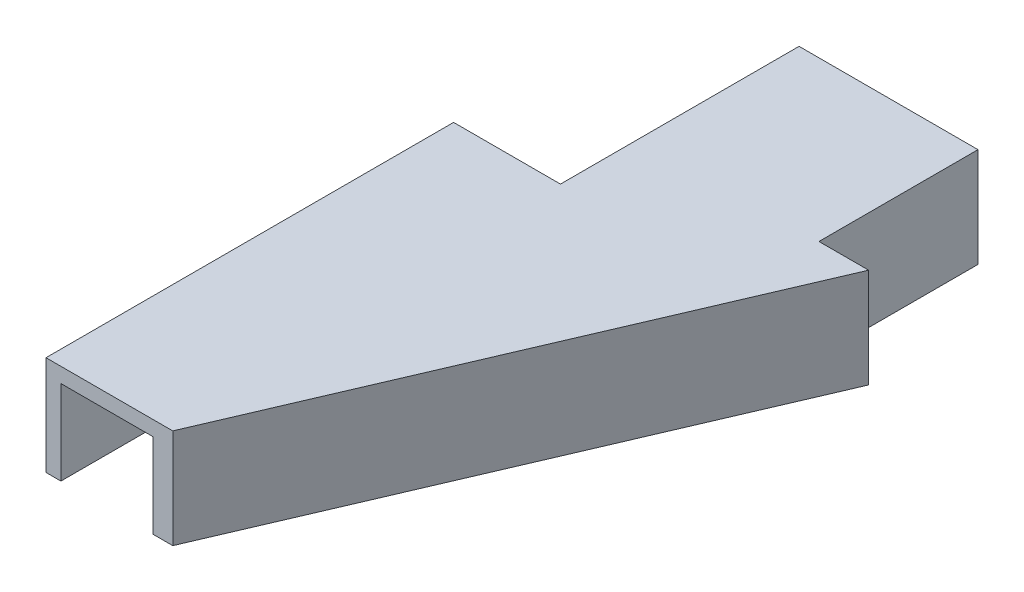
ISO-10303-21;
HEADER;
FILE_DESCRIPTION(('STEP AP214'),'2;1');
FILE_NAME('part.step','',(''),(''),'','','');
FILE_SCHEMA(('AUTOMOTIVE_DESIGN { 1 0 10303 214 1 1 1 1 }'));
ENDSEC;
DATA;
#1=APPLICATION_CONTEXT('core data for automotive mechanical design processes');
#2=APPLICATION_PROTOCOL_DEFINITION('international standard','automotive_design',2000,#1);
#3=PRODUCT_CONTEXT('',#1,'mechanical');
#4=PRODUCT('Part','Part','',(#3));
#5=PRODUCT_RELATED_PRODUCT_CATEGORY('part','',(#4));
#6=PRODUCT_DEFINITION_FORMATION('','',#4);
#7=PRODUCT_DEFINITION_CONTEXT('part definition',#1,'design');
#8=PRODUCT_DEFINITION('design','',#6,#7);
#9=PRODUCT_DEFINITION_SHAPE('','',#8);
#10=(LENGTH_UNIT() NAMED_UNIT(*) SI_UNIT(.MILLI.,.METRE.));
#11=(NAMED_UNIT(*) PLANE_ANGLE_UNIT() SI_UNIT($,.RADIAN.));
#12=(NAMED_UNIT(*) SI_UNIT($,.STERADIAN.) SOLID_ANGLE_UNIT());
#13=UNCERTAINTY_MEASURE_WITH_UNIT(LENGTH_MEASURE(1.E-05),#10,'distance_accuracy_value','');
#14=(GEOMETRIC_REPRESENTATION_CONTEXT(3) GLOBAL_UNCERTAINTY_ASSIGNED_CONTEXT((#13)) GLOBAL_UNIT_ASSIGNED_CONTEXT((#10,
#11,#12)) REPRESENTATION_CONTEXT('',''));
#15=CARTESIAN_POINT('',(0.,0.,0.));
#16=DIRECTION('',(0.,0.,1.));
#17=DIRECTION('',(1.,0.,0.));
#18=AXIS2_PLACEMENT_3D('',#15,#16,#17);
#19=CARTESIAN_POINT('',(0.,20.,0.));
#20=DIRECTION('',(1.,0.,0.));
#21=DIRECTION('',(0.,0.,-1.));
#22=AXIS2_PLACEMENT_3D('',#19,#20,#21);
#23=PLANE('',#22);
#24=DIRECTION('',(0.,-1.,0.));
#25=VECTOR('',#24,1.);
#26=CARTESIAN_POINT('',(0.,0.,-80.));
#27=LINE('',#26,#25);
#28=CARTESIAN_POINT('',(0.,17.,-80.));
#29=VERTEX_POINT('',#28);
#30=CARTESIAN_POINT('',(0.,0.,-80.));
#31=VERTEX_POINT('',#30);
#32=EDGE_CURVE('E243',#29,#31,#27,.T.);
#33=ORIENTED_EDGE('',*,*,#32,.T.);
#34=DIRECTION('',(0.,0.,1.));
#35=VECTOR('',#34,1.);
#36=CARTESIAN_POINT('',(0.,0.,0.));
#37=LINE('',#36,#35);
#38=CARTESIAN_POINT('',(0.,0.,0.));
#39=VERTEX_POINT('',#38);
#40=EDGE_CURVE('E85',#31,#39,#37,.T.);
#41=ORIENTED_EDGE('',*,*,#40,.T.);
#42=DIRECTION('',(0.,-1.,0.));
#43=VECTOR('',#42,1.);
#44=CARTESIAN_POINT('',(0.,20.,0.));
#45=LINE('',#44,#43);
#46=CARTESIAN_POINT('',(0.,17.,0.));
#47=VERTEX_POINT('',#46);
#48=EDGE_CURVE('E126',#47,#39,#45,.T.);
#49=ORIENTED_EDGE('',*,*,#48,.F.);
#50=DIRECTION('',(0.,0.,1.));
#51=VECTOR('',#50,1.);
#52=CARTESIAN_POINT('',(0.,17.,-85.));
#53=LINE('',#52,#51);
#54=EDGE_CURVE('E131',#29,#47,#53,.T.);
#55=ORIENTED_EDGE('',*,*,#54,.F.);
#56=EDGE_LOOP('',(#33,#41,#49,#55));
#57=FACE_BOUND('',#56,.T.);
#58=ADVANCED_FACE('F33',(#57),#23,.F.);
#59=CARTESIAN_POINT('',(0.,20.,0.));
#60=DIRECTION('',(0.,-1.,0.));
#61=DIRECTION('',(0.,0.,-1.));
#62=AXIS2_PLACEMENT_3D('',#59,#60,#61);
#63=PLANE('',#62);
#64=DIRECTION('',(0.,0.,1.));
#65=VECTOR('',#64,1.);
#66=CARTESIAN_POINT('',(0.,20.,0.));
#67=LINE('',#66,#65);
#68=CARTESIAN_POINT('',(0.,20.,-130.));
#69=VERTEX_POINT('',#68);
#70=CARTESIAN_POINT('',(0.,20.,-82.));
#71=VERTEX_POINT('',#70);
#72=EDGE_CURVE('E121',#69,#71,#67,.T.);
#73=ORIENTED_EDGE('',*,*,#72,.T.);
#74=DIRECTION('',(1.,0.,0.));
#75=VECTOR('',#74,1.);
#76=CARTESIAN_POINT('',(-21.5,20.,-82.));
#77=LINE('',#76,#75);
#78=CARTESIAN_POINT('',(-21.5,20.,-82.));
#79=VERTEX_POINT('',#78);
#80=EDGE_CURVE('E164',#79,#71,#77,.T.);
#81=ORIENTED_EDGE('',*,*,#80,.F.);
#82=DIRECTION('',(0.,0.,1.));
#83=VECTOR('',#82,1.);
#84=CARTESIAN_POINT('',(-21.5,20.,-85.));
#85=LINE('',#84,#83);
#86=CARTESIAN_POINT('',(-21.5,20.,0.));
#87=VERTEX_POINT('',#86);
#88=EDGE_CURVE('E241',#79,#87,#85,.T.);
#89=ORIENTED_EDGE('',*,*,#88,.T.);
#90=DIRECTION('',(1.,0.,0.));
#91=VECTOR('',#90,1.);
#92=CARTESIAN_POINT('',(0.,20.,0.));
#93=LINE('',#92,#91);
#94=CARTESIAN_POINT('',(4.,20.,0.));
#95=VERTEX_POINT('',#94);
#96=EDGE_CURVE('E141',#87,#95,#93,.T.);
#97=ORIENTED_EDGE('',*,*,#96,.T.);
#98=DIRECTION('',(0.393919298579168,0.,-0.919145030018058));
#99=VECTOR('',#98,1.);
#100=CARTESIAN_POINT('',(4.,20.,0.));
#101=LINE('',#100,#99);
#102=CARTESIAN_POINT('',(46.,20.,-98.));
#103=VERTEX_POINT('',#102);
#104=EDGE_CURVE('E93',#95,#103,#101,.T.);
#105=ORIENTED_EDGE('',*,*,#104,.T.);
#106=DIRECTION('',(-1.,0.,0.));
#107=VECTOR('',#106,1.);
#108=CARTESIAN_POINT('',(36.,20.,-98.));
#109=LINE('',#108,#107);
#110=CARTESIAN_POINT('',(36.,20.,-98.));
#111=VERTEX_POINT('',#110);
#112=EDGE_CURVE('E100',#103,#111,#109,.T.);
#113=ORIENTED_EDGE('',*,*,#112,.T.);
#114=DIRECTION('',(0.,0.,-1.));
#115=VECTOR('',#114,1.);
#116=CARTESIAN_POINT('',(36.,20.,-130.));
#117=LINE('',#116,#115);
#118=CARTESIAN_POINT('',(36.,20.,-130.));
#119=VERTEX_POINT('',#118);
#120=EDGE_CURVE('E104',#111,#119,#117,.T.);
#121=ORIENTED_EDGE('',*,*,#120,.T.);
#122=DIRECTION('',(-1.,0.,0.));
#123=VECTOR('',#122,1.);
#124=CARTESIAN_POINT('',(0.,20.,-130.));
#125=LINE('',#124,#123);
#126=EDGE_CURVE('E57',#119,#69,#125,.T.);
#127=ORIENTED_EDGE('',*,*,#126,.T.);
#128=EDGE_LOOP('',(#73,#81,#89,#97,#105,#113,#121,#127));
#129=FACE_BOUND('',#128,.T.);
#130=ADVANCED_FACE('F102',(#129),#63,.F.);
#131=CARTESIAN_POINT('',(-18.5,17.,-85.));
#132=DIRECTION('',(0.,-1.,0.));
#133=DIRECTION('',(0.,0.,-1.));
#134=AXIS2_PLACEMENT_3D('',#131,#132,#133);
#135=PLANE('',#134);
#136=DIRECTION('',(0.,0.,1.));
#137=VECTOR('',#136,1.);
#138=CARTESIAN_POINT('',(-18.5,17.,-85.));
#139=LINE('',#138,#137);
#140=CARTESIAN_POINT('',(-18.5,17.,-80.));
#141=VERTEX_POINT('',#140);
#142=CARTESIAN_POINT('',(-18.5,17.,0.));
#143=VERTEX_POINT('',#142);
#144=EDGE_CURVE('E226',#141,#143,#139,.T.);
#145=ORIENTED_EDGE('',*,*,#144,.F.);
#146=DIRECTION('',(1.,0.,0.));
#147=VECTOR('',#146,1.);
#148=CARTESIAN_POINT('',(-18.5,17.,-80.));
#149=LINE('',#148,#147);
#150=EDGE_CURVE('E236',#141,#29,#149,.T.);
#151=ORIENTED_EDGE('',*,*,#150,.T.);
#152=ORIENTED_EDGE('',*,*,#54,.T.);
#153=DIRECTION('',(1.,0.,0.));
#154=VECTOR('',#153,1.);
#155=CARTESIAN_POINT('',(-18.5,17.,0.));
#156=LINE('',#155,#154);
#157=EDGE_CURVE('E235',#143,#47,#156,.T.);
#158=ORIENTED_EDGE('',*,*,#157,.F.);
#159=EDGE_LOOP('',(#145,#151,#152,#158));
#160=FACE_BOUND('',#159,.T.);
#161=ADVANCED_FACE('F234',(#160),#135,.T.);
#162=CARTESIAN_POINT('',(-18.5,0.,-85.));
#163=DIRECTION('',(1.,0.,0.));
#164=DIRECTION('',(0.,0.,-1.));
#165=AXIS2_PLACEMENT_3D('',#162,#163,#164);
#166=PLANE('',#165);
#167=DIRECTION('',(0.,0.,1.));
#168=VECTOR('',#167,1.);
#169=CARTESIAN_POINT('',(-18.5,0.,-85.));
#170=LINE('',#169,#168);
#171=CARTESIAN_POINT('',(-18.5,0.,-80.));
#172=VERTEX_POINT('',#171);
#173=CARTESIAN_POINT('',(-18.5,0.,0.));
#174=VERTEX_POINT('',#173);
#175=EDGE_CURVE('E321',#172,#174,#170,.T.);
#176=ORIENTED_EDGE('',*,*,#175,.F.);
#177=DIRECTION('',(0.,1.,0.));
#178=VECTOR('',#177,1.);
#179=CARTESIAN_POINT('',(-18.5,0.,-80.));
#180=LINE('',#179,#178);
#181=EDGE_CURVE('E303',#172,#141,#180,.T.);
#182=ORIENTED_EDGE('',*,*,#181,.T.);
#183=ORIENTED_EDGE('',*,*,#144,.T.);
#184=DIRECTION('',(0.,1.,0.));
#185=VECTOR('',#184,1.);
#186=CARTESIAN_POINT('',(-18.5,0.,0.));
#187=LINE('',#186,#185);
#188=EDGE_CURVE('E240',#174,#143,#187,.T.);
#189=ORIENTED_EDGE('',*,*,#188,.F.);
#190=EDGE_LOOP('',(#176,#182,#183,#189));
#191=FACE_BOUND('',#190,.T.);
#192=ADVANCED_FACE('F259',(#191),#166,.T.);
#193=CARTESIAN_POINT('',(-21.5,20.,-85.));
#194=DIRECTION('',(-1.,0.,0.));
#195=DIRECTION('',(0.,-1.,0.));
#196=AXIS2_PLACEMENT_3D('',#193,#194,#195);
#197=PLANE('',#196);
#198=ORIENTED_EDGE('',*,*,#88,.F.);
#199=DIRECTION('',(0.,1.,0.));
#200=VECTOR('',#199,1.);
#201=CARTESIAN_POINT('',(-21.5,0.,-82.));
#202=LINE('',#201,#200);
#203=CARTESIAN_POINT('',(-21.5,0.,-82.));
#204=VERTEX_POINT('',#203);
#205=EDGE_CURVE('E475',#204,#79,#202,.T.);
#206=ORIENTED_EDGE('',*,*,#205,.F.);
#207=DIRECTION('',(0.,0.,1.));
#208=VECTOR('',#207,1.);
#209=CARTESIAN_POINT('',(-21.5,0.,-85.));
#210=LINE('',#209,#208);
#211=CARTESIAN_POINT('',(-21.5,0.,0.));
#212=VERTEX_POINT('',#211);
#213=EDGE_CURVE('E323',#204,#212,#210,.T.);
#214=ORIENTED_EDGE('',*,*,#213,.T.);
#215=DIRECTION('',(0.,-1.,0.));
#216=VECTOR('',#215,1.);
#217=CARTESIAN_POINT('',(-21.5,20.,0.));
#218=LINE('',#217,#216);
#219=EDGE_CURVE('E314',#87,#212,#218,.T.);
#220=ORIENTED_EDGE('',*,*,#219,.F.);
#221=EDGE_LOOP('',(#198,#206,#214,#220));
#222=FACE_BOUND('',#221,.T.);
#223=ADVANCED_FACE('F253',(#222),#197,.T.);
#224=CARTESIAN_POINT('',(0.,0.,-130.));
#225=VERTEX_POINT('',#224);
#226=CARTESIAN_POINT('',(0.,0.,-82.));
#227=VERTEX_POINT('',#226);
#228=EDGE_CURVE('E138',#225,#227,#37,.T.);
#229=ORIENTED_EDGE('',*,*,#228,.T.);
#230=DIRECTION('',(0.,-1.,0.));
#231=VECTOR('',#230,1.);
#232=CARTESIAN_POINT('',(0.,0.,-82.));
#233=LINE('',#232,#231);
#234=EDGE_CURVE('E159',#71,#227,#233,.T.);
#235=ORIENTED_EDGE('',*,*,#234,.F.);
#236=ORIENTED_EDGE('',*,*,#72,.F.);
#237=DIRECTION('',(0.,-1.,0.));
#238=VECTOR('',#237,1.);
#239=CARTESIAN_POINT('',(0.,20.,-130.));
#240=LINE('',#239,#238);
#241=EDGE_CURVE('E143',#69,#225,#240,.T.);
#242=ORIENTED_EDGE('',*,*,#241,.T.);
#243=EDGE_LOOP('',(#229,#235,#236,#242));
#244=FACE_BOUND('',#243,.T.);
#245=ADVANCED_FACE('F156',(#244),#23,.F.);
#246=CARTESIAN_POINT('',(0.,20.,0.));
#247=DIRECTION('',(0.,0.,-1.));
#248=DIRECTION('',(-1.,0.,0.));
#249=AXIS2_PLACEMENT_3D('',#246,#247,#248);
#250=PLANE('',#249);
#251=DIRECTION('',(1.,0.,0.));
#252=VECTOR('',#251,1.);
#253=CARTESIAN_POINT('',(0.,0.,0.));
#254=LINE('',#253,#252);
#255=CARTESIAN_POINT('',(4.,0.,0.));
#256=VERTEX_POINT('',#255);
#257=EDGE_CURVE('E127',#39,#256,#254,.T.);
#258=ORIENTED_EDGE('',*,*,#257,.T.);
#259=DIRECTION('',(0.,-1.,0.));
#260=VECTOR('',#259,1.);
#261=CARTESIAN_POINT('',(4.,20.,0.));
#262=LINE('',#261,#260);
#263=EDGE_CURVE('E11',#95,#256,#262,.T.);
#264=ORIENTED_EDGE('',*,*,#263,.F.);
#265=ORIENTED_EDGE('',*,*,#96,.F.);
#266=ORIENTED_EDGE('',*,*,#219,.T.);
#267=DIRECTION('',(1.,0.,0.));
#268=VECTOR('',#267,1.);
#269=CARTESIAN_POINT('',(-21.5,0.,0.));
#270=LINE('',#269,#268);
#271=EDGE_CURVE('E317',#212,#174,#270,.T.);
#272=ORIENTED_EDGE('',*,*,#271,.T.);
#273=ORIENTED_EDGE('',*,*,#188,.T.);
#274=ORIENTED_EDGE('',*,*,#157,.T.);
#275=ORIENTED_EDGE('',*,*,#48,.T.);
#276=EDGE_LOOP('',(#258,#264,#265,#266,#272,#273,#274,#275));
#277=FACE_BOUND('',#276,.T.);
#278=ADVANCED_FACE('F35',(#277),#250,.F.);
#279=CARTESIAN_POINT('',(4.,20.,0.));
#280=DIRECTION('',(-0.919145030018058,0.,-0.393919298579168));
#281=DIRECTION('',(-0.393919298579168,0.,0.919145030018058));
#282=AXIS2_PLACEMENT_3D('',#279,#280,#281);
#283=PLANE('',#282);
#284=DIRECTION('',(0.393919298579168,0.,-0.919145030018058));
#285=VECTOR('',#284,1.);
#286=CARTESIAN_POINT('',(4.,0.,0.));
#287=LINE('',#286,#285);
#288=CARTESIAN_POINT('',(46.,0.,-98.));
#289=VERTEX_POINT('',#288);
#290=EDGE_CURVE('E130',#256,#289,#287,.T.);
#291=ORIENTED_EDGE('',*,*,#290,.T.);
#292=DIRECTION('',(0.,-1.,0.));
#293=VECTOR('',#292,1.);
#294=CARTESIAN_POINT('',(46.,20.,-98.));
#295=LINE('',#294,#293);
#296=EDGE_CURVE('E41',#103,#289,#295,.T.);
#297=ORIENTED_EDGE('',*,*,#296,.F.);
#298=ORIENTED_EDGE('',*,*,#104,.F.);
#299=ORIENTED_EDGE('',*,*,#263,.T.);
#300=EDGE_LOOP('',(#291,#297,#298,#299));
#301=FACE_BOUND('',#300,.T.);
#302=ADVANCED_FACE('F258',(#301),#283,.F.);
#303=CARTESIAN_POINT('',(36.,20.,-98.));
#304=DIRECTION('',(0.,0.,1.));
#305=DIRECTION('',(1.,0.,0.));
#306=AXIS2_PLACEMENT_3D('',#303,#304,#305);
#307=PLANE('',#306);
#308=DIRECTION('',(-1.,0.,0.));
#309=VECTOR('',#308,1.);
#310=CARTESIAN_POINT('',(36.,0.,-98.));
#311=LINE('',#310,#309);
#312=CARTESIAN_POINT('',(36.,0.,-98.));
#313=VERTEX_POINT('',#312);
#314=EDGE_CURVE('E113',#289,#313,#311,.T.);
#315=ORIENTED_EDGE('',*,*,#314,.T.);
#316=DIRECTION('',(0.,-1.,0.));
#317=VECTOR('',#316,1.);
#318=CARTESIAN_POINT('',(36.,20.,-98.));
#319=LINE('',#318,#317);
#320=EDGE_CURVE('E110',#111,#313,#319,.T.);
#321=ORIENTED_EDGE('',*,*,#320,.F.);
#322=ORIENTED_EDGE('',*,*,#112,.F.);
#323=ORIENTED_EDGE('',*,*,#296,.T.);
#324=EDGE_LOOP('',(#315,#321,#322,#323));
#325=FACE_BOUND('',#324,.T.);
#326=ADVANCED_FACE('F111',(#325),#307,.F.);
#327=CARTESIAN_POINT('',(36.,20.,-130.));
#328=DIRECTION('',(-1.,0.,0.));
#329=DIRECTION('',(0.,0.,1.));
#330=AXIS2_PLACEMENT_3D('',#327,#328,#329);
#331=PLANE('',#330);
#332=DIRECTION('',(0.,0.,-1.));
#333=VECTOR('',#332,1.);
#334=CARTESIAN_POINT('',(36.,0.,-130.));
#335=LINE('',#334,#333);
#336=CARTESIAN_POINT('',(36.,0.,-130.));
#337=VERTEX_POINT('',#336);
#338=EDGE_CURVE('E134',#313,#337,#335,.T.);
#339=ORIENTED_EDGE('',*,*,#338,.T.);
#340=DIRECTION('',(0.,-1.,0.));
#341=VECTOR('',#340,1.);
#342=CARTESIAN_POINT('',(36.,20.,-130.));
#343=LINE('',#342,#341);
#344=EDGE_CURVE('E116',#119,#337,#343,.T.);
#345=ORIENTED_EDGE('',*,*,#344,.F.);
#346=ORIENTED_EDGE('',*,*,#120,.F.);
#347=ORIENTED_EDGE('',*,*,#320,.T.);
#348=EDGE_LOOP('',(#339,#345,#346,#347));
#349=FACE_BOUND('',#348,.T.);
#350=ADVANCED_FACE('F118',(#349),#331,.F.);
#351=CARTESIAN_POINT('',(0.,20.,-130.));
#352=DIRECTION('',(0.,0.,1.));
#353=DIRECTION('',(1.,0.,0.));
#354=AXIS2_PLACEMENT_3D('',#351,#352,#353);
#355=PLANE('',#354);
#356=DIRECTION('',(-1.,0.,0.));
#357=VECTOR('',#356,1.);
#358=CARTESIAN_POINT('',(0.,0.,-130.));
#359=LINE('',#358,#357);
#360=EDGE_CURVE('E136',#337,#225,#359,.T.);
#361=ORIENTED_EDGE('',*,*,#360,.T.);
#362=ORIENTED_EDGE('',*,*,#241,.F.);
#363=ORIENTED_EDGE('',*,*,#126,.F.);
#364=ORIENTED_EDGE('',*,*,#344,.T.);
#365=EDGE_LOOP('',(#361,#362,#363,#364));
#366=FACE_BOUND('',#365,.T.);
#367=ADVANCED_FACE('F152',(#366),#355,.F.);
#368=CARTESIAN_POINT('',(0.,0.,0.));
#369=DIRECTION('',(0.,-1.,0.));
#370=DIRECTION('',(0.,0.,-1.));
#371=AXIS2_PLACEMENT_3D('',#368,#369,#370);
#372=PLANE('',#371);
#373=DIRECTION('',(-0.393919298579167,0.,0.919145030018058));
#374=VECTOR('',#373,1.);
#375=CARTESIAN_POINT('',(38.4173049243829,0.,-93.));
#376=LINE('',#375,#374);
#377=CARTESIAN_POINT('',(38.4173049243829,0.,-93.));
#378=VERTEX_POINT('',#377);
#379=CARTESIAN_POINT('',(5.,0.,-15.0262885097732));
#380=VERTEX_POINT('',#379);
#381=EDGE_CURVE('E48',#378,#380,#376,.T.);
#382=ORIENTED_EDGE('',*,*,#381,.F.);
#383=DIRECTION('',(1.,0.,0.));
#384=VECTOR('',#383,1.);
#385=CARTESIAN_POINT('',(31.,0.,-93.));
#386=LINE('',#385,#384);
#387=CARTESIAN_POINT('',(31.,0.,-93.));
#388=VERTEX_POINT('',#387);
#389=EDGE_CURVE('E280',#388,#378,#386,.T.);
#390=ORIENTED_EDGE('',*,*,#389,.F.);
#391=DIRECTION('',(0.,0.,1.));
#392=VECTOR('',#391,1.);
#393=CARTESIAN_POINT('',(31.,0.,-125.));
#394=LINE('',#393,#392);
#395=CARTESIAN_POINT('',(31.,0.,-125.));
#396=VERTEX_POINT('',#395);
#397=EDGE_CURVE('E296',#396,#388,#394,.T.);
#398=ORIENTED_EDGE('',*,*,#397,.F.);
#399=DIRECTION('',(1.,0.,0.));
#400=VECTOR('',#399,1.);
#401=CARTESIAN_POINT('',(5.,0.,-125.));
#402=LINE('',#401,#400);
#403=CARTESIAN_POINT('',(5.,0.,-125.));
#404=VERTEX_POINT('',#403);
#405=EDGE_CURVE('E286',#404,#396,#402,.T.);
#406=ORIENTED_EDGE('',*,*,#405,.F.);
#407=DIRECTION('',(0.,0.,-1.));
#408=VECTOR('',#407,1.);
#409=CARTESIAN_POINT('',(5.,0.,-15.0262885097732));
#410=LINE('',#409,#408);
#411=EDGE_CURVE('E283',#380,#404,#410,.T.);
#412=ORIENTED_EDGE('',*,*,#411,.F.);
#413=EDGE_LOOP('',(#382,#390,#398,#406,#412));
#414=FACE_BOUND('',#413,.T.);
#415=ORIENTED_EDGE('',*,*,#257,.F.);
#416=ORIENTED_EDGE('',*,*,#40,.F.);
#417=DIRECTION('',(-1.,0.,0.));
#418=VECTOR('',#417,1.);
#419=CARTESIAN_POINT('',(-21.5,0.,-80.));
#420=LINE('',#419,#418);
#421=EDGE_CURVE('E474',#31,#172,#420,.T.);
#422=ORIENTED_EDGE('',*,*,#421,.T.);
#423=ORIENTED_EDGE('',*,*,#175,.T.);
#424=ORIENTED_EDGE('',*,*,#271,.F.);
#425=ORIENTED_EDGE('',*,*,#213,.F.);
#426=DIRECTION('',(-1.,0.,0.));
#427=VECTOR('',#426,1.);
#428=CARTESIAN_POINT('',(-21.5,0.,-82.));
#429=LINE('',#428,#427);
#430=EDGE_CURVE('E284',#227,#204,#429,.T.);
#431=ORIENTED_EDGE('',*,*,#430,.F.);
#432=ORIENTED_EDGE('',*,*,#228,.F.);
#433=ORIENTED_EDGE('',*,*,#360,.F.);
#434=ORIENTED_EDGE('',*,*,#338,.F.);
#435=ORIENTED_EDGE('',*,*,#314,.F.);
#436=ORIENTED_EDGE('',*,*,#290,.F.);
#437=EDGE_LOOP('',(#415,#416,#422,#423,#424,#425,#431,#432,#433,#434,#435,#436));
#438=FACE_BOUND('',#437,.T.);
#439=ADVANCED_FACE('F148',(#414,#438),#372,.T.);
#440=CARTESIAN_POINT('',(38.4173049243829,17.,-93.));
#441=DIRECTION('',(0.919145030018058,0.,0.393919298579167));
#442=DIRECTION('',(0.393919298579168,0.,-0.919145030018058));
#443=AXIS2_PLACEMENT_3D('',#440,#441,#442);
#444=PLANE('',#443);
#445=ORIENTED_EDGE('',*,*,#381,.T.);
#446=DIRECTION('',(0.,-1.,0.));
#447=VECTOR('',#446,1.);
#448=CARTESIAN_POINT('',(5.,17.,-15.0262885097732));
#449=LINE('',#448,#447);
#450=CARTESIAN_POINT('',(5.,17.,-15.0262885097732));
#451=VERTEX_POINT('',#450);
#452=EDGE_CURVE('E310',#451,#380,#449,.T.);
#453=ORIENTED_EDGE('',*,*,#452,.F.);
#454=DIRECTION('',(-0.393919298579167,0.,0.919145030018058));
#455=VECTOR('',#454,1.);
#456=CARTESIAN_POINT('',(38.4173049243829,17.,-93.));
#457=LINE('',#456,#455);
#458=CARTESIAN_POINT('',(38.4173049243829,17.,-93.));
#459=VERTEX_POINT('',#458);
#460=EDGE_CURVE('E300',#459,#451,#457,.T.);
#461=ORIENTED_EDGE('',*,*,#460,.F.);
#462=DIRECTION('',(0.,-1.,0.));
#463=VECTOR('',#462,1.);
#464=CARTESIAN_POINT('',(38.4173049243829,17.,-93.));
#465=LINE('',#464,#463);
#466=EDGE_CURVE('E301',#459,#378,#465,.T.);
#467=ORIENTED_EDGE('',*,*,#466,.T.);
#468=EDGE_LOOP('',(#445,#453,#461,#467));
#469=FACE_BOUND('',#468,.T.);
#470=ADVANCED_FACE('F268',(#469),#444,.F.);
#471=CARTESIAN_POINT('',(31.,17.,-93.));
#472=DIRECTION('',(0.,0.,-1.));
#473=DIRECTION('',(-1.,0.,0.));
#474=AXIS2_PLACEMENT_3D('',#471,#472,#473);
#475=PLANE('',#474);
#476=ORIENTED_EDGE('',*,*,#389,.T.);
#477=ORIENTED_EDGE('',*,*,#466,.F.);
#478=DIRECTION('',(1.,0.,0.));
#479=VECTOR('',#478,1.);
#480=CARTESIAN_POINT('',(31.,17.,-93.));
#481=LINE('',#480,#479);
#482=CARTESIAN_POINT('',(31.,17.,-93.));
#483=VERTEX_POINT('',#482);
#484=EDGE_CURVE('E291',#483,#459,#481,.T.);
#485=ORIENTED_EDGE('',*,*,#484,.F.);
#486=DIRECTION('',(0.,-1.,0.));
#487=VECTOR('',#486,1.);
#488=CARTESIAN_POINT('',(31.,17.,-93.));
#489=LINE('',#488,#487);
#490=EDGE_CURVE('E304',#483,#388,#489,.T.);
#491=ORIENTED_EDGE('',*,*,#490,.T.);
#492=EDGE_LOOP('',(#476,#477,#485,#491));
#493=FACE_BOUND('',#492,.T.);
#494=ADVANCED_FACE('F274',(#493),#475,.F.);
#495=CARTESIAN_POINT('',(31.,17.,-125.));
#496=DIRECTION('',(1.,0.,0.));
#497=DIRECTION('',(0.,0.,-1.));
#498=AXIS2_PLACEMENT_3D('',#495,#496,#497);
#499=PLANE('',#498);
#500=ORIENTED_EDGE('',*,*,#397,.T.);
#501=ORIENTED_EDGE('',*,*,#490,.F.);
#502=DIRECTION('',(0.,0.,1.));
#503=VECTOR('',#502,1.);
#504=CARTESIAN_POINT('',(31.,17.,-125.));
#505=LINE('',#504,#503);
#506=CARTESIAN_POINT('',(31.,17.,-125.));
#507=VERTEX_POINT('',#506);
#508=EDGE_CURVE('E487',#507,#483,#505,.T.);
#509=ORIENTED_EDGE('',*,*,#508,.F.);
#510=DIRECTION('',(0.,-1.,0.));
#511=VECTOR('',#510,1.);
#512=CARTESIAN_POINT('',(31.,17.,-125.));
#513=LINE('',#512,#511);
#514=EDGE_CURVE('E306',#507,#396,#513,.T.);
#515=ORIENTED_EDGE('',*,*,#514,.T.);
#516=EDGE_LOOP('',(#500,#501,#509,#515));
#517=FACE_BOUND('',#516,.T.);
#518=ADVANCED_FACE('F370',(#517),#499,.F.);
#519=CARTESIAN_POINT('',(5.,17.,-125.));
#520=DIRECTION('',(0.,0.,-1.));
#521=DIRECTION('',(-1.,0.,0.));
#522=AXIS2_PLACEMENT_3D('',#519,#520,#521);
#523=PLANE('',#522);
#524=ORIENTED_EDGE('',*,*,#405,.T.);
#525=ORIENTED_EDGE('',*,*,#514,.F.);
#526=DIRECTION('',(1.,0.,0.));
#527=VECTOR('',#526,1.);
#528=CARTESIAN_POINT('',(5.,17.,-125.));
#529=LINE('',#528,#527);
#530=CARTESIAN_POINT('',(5.,17.,-125.));
#531=VERTEX_POINT('',#530);
#532=EDGE_CURVE('E485',#531,#507,#529,.T.);
#533=ORIENTED_EDGE('',*,*,#532,.F.);
#534=DIRECTION('',(0.,-1.,0.));
#535=VECTOR('',#534,1.);
#536=CARTESIAN_POINT('',(5.,17.,-125.));
#537=LINE('',#536,#535);
#538=EDGE_CURVE('E308',#531,#404,#537,.T.);
#539=ORIENTED_EDGE('',*,*,#538,.T.);
#540=EDGE_LOOP('',(#524,#525,#533,#539));
#541=FACE_BOUND('',#540,.T.);
#542=ADVANCED_FACE('F380',(#541),#523,.F.);
#543=CARTESIAN_POINT('',(5.,17.,-15.0262885097732));
#544=DIRECTION('',(-1.,0.,0.));
#545=DIRECTION('',(0.,0.,1.));
#546=AXIS2_PLACEMENT_3D('',#543,#544,#545);
#547=PLANE('',#546);
#548=ORIENTED_EDGE('',*,*,#411,.T.);
#549=ORIENTED_EDGE('',*,*,#538,.F.);
#550=DIRECTION('',(0.,0.,-1.));
#551=VECTOR('',#550,1.);
#552=CARTESIAN_POINT('',(5.,17.,-15.0262885097732));
#553=LINE('',#552,#551);
#554=EDGE_CURVE('E482',#451,#531,#553,.T.);
#555=ORIENTED_EDGE('',*,*,#554,.F.);
#556=ORIENTED_EDGE('',*,*,#452,.T.);
#557=EDGE_LOOP('',(#548,#549,#555,#556));
#558=FACE_BOUND('',#557,.T.);
#559=ADVANCED_FACE('F390',(#558),#547,.F.);
#560=CARTESIAN_POINT('',(0.,17.,0.));
#561=DIRECTION('',(0.,1.,0.));
#562=DIRECTION('',(0.,0.,1.));
#563=AXIS2_PLACEMENT_3D('',#560,#561,#562);
#564=PLANE('',#563);
#565=ORIENTED_EDGE('',*,*,#460,.T.);
#566=ORIENTED_EDGE('',*,*,#554,.T.);
#567=ORIENTED_EDGE('',*,*,#532,.T.);
#568=ORIENTED_EDGE('',*,*,#508,.T.);
#569=ORIENTED_EDGE('',*,*,#484,.T.);
#570=EDGE_LOOP('',(#565,#566,#567,#568,#569));
#571=FACE_BOUND('',#570,.T.);
#572=ADVANCED_FACE('F400',(#571),#564,.F.);
#573=CARTESIAN_POINT('',(0.,0.,-82.));
#574=DIRECTION('',(0.,0.,-1.));
#575=DIRECTION('',(-1.,0.,0.));
#576=AXIS2_PLACEMENT_3D('',#573,#574,#575);
#577=PLANE('',#576);
#578=ORIENTED_EDGE('',*,*,#205,.T.);
#579=ORIENTED_EDGE('',*,*,#80,.T.);
#580=ORIENTED_EDGE('',*,*,#234,.T.);
#581=ORIENTED_EDGE('',*,*,#430,.T.);
#582=EDGE_LOOP('',(#578,#579,#580,#581));
#583=FACE_BOUND('',#582,.T.);
#584=ADVANCED_FACE('F409',(#583),#577,.T.);
#585=CARTESIAN_POINT('',(0.,0.,-80.));
#586=DIRECTION('',(0.,0.,-1.));
#587=DIRECTION('',(-1.,0.,0.));
#588=AXIS2_PLACEMENT_3D('',#585,#586,#587);
#589=PLANE('',#588);
#590=ORIENTED_EDGE('',*,*,#150,.F.);
#591=ORIENTED_EDGE('',*,*,#181,.F.);
#592=ORIENTED_EDGE('',*,*,#421,.F.);
#593=ORIENTED_EDGE('',*,*,#32,.F.);
#594=EDGE_LOOP('',(#590,#591,#592,#593));
#595=FACE_BOUND('',#594,.T.);
#596=ADVANCED_FACE('F458',(#595),#589,.F.);
#597=CLOSED_SHELL('',(#58,#130,#161,#192,#223,#245,#278,#302,#326,#350,#367,#439,#470,#494,#518,
#542,#559,#572,#584,#596));
#598=MANIFOLD_SOLID_BREP('B2',#597);
#599=ADVANCED_BREP_SHAPE_REPRESENTATION('',(#18,#598),#14);
#600=SHAPE_DEFINITION_REPRESENTATION(#9,#599);
ENDSEC;
END-ISO-10303-21;
